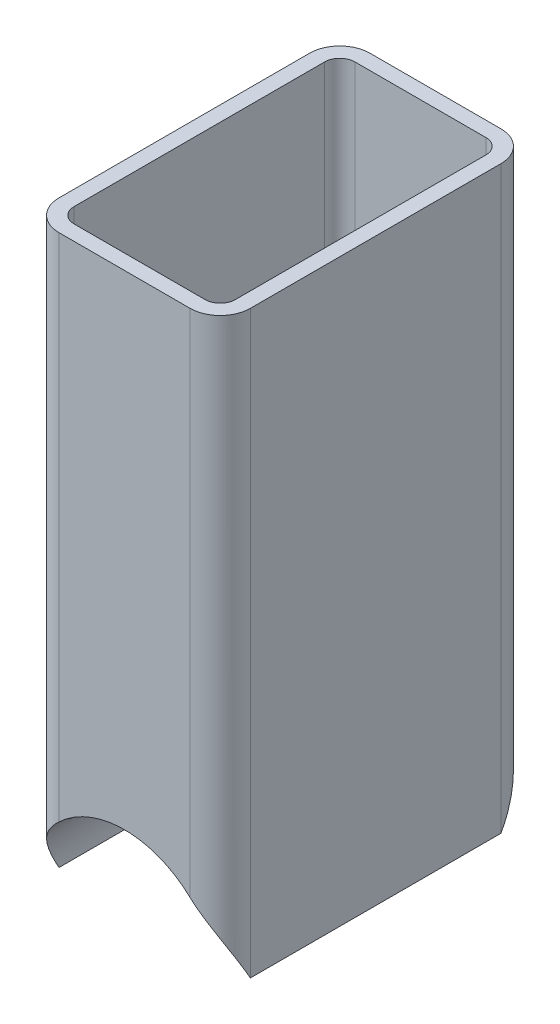
ISO-10303-21;
HEADER;
FILE_DESCRIPTION(('STEP AP214'),'2;1');
FILE_NAME('part.step','',(''),(''),'','','');
FILE_SCHEMA(('AUTOMOTIVE_DESIGN { 1 0 10303 214 1 1 1 1 }'));
ENDSEC;
DATA;
#1=APPLICATION_CONTEXT('core data for automotive mechanical design processes');
#2=APPLICATION_PROTOCOL_DEFINITION('international standard','automotive_design',2000,#1);
#3=PRODUCT_CONTEXT('',#1,'mechanical');
#4=PRODUCT('Part','Part','',(#3));
#5=PRODUCT_RELATED_PRODUCT_CATEGORY('part','',(#4));
#6=PRODUCT_DEFINITION_FORMATION('','',#4);
#7=PRODUCT_DEFINITION_CONTEXT('part definition',#1,'design');
#8=PRODUCT_DEFINITION('design','',#6,#7);
#9=PRODUCT_DEFINITION_SHAPE('','',#8);
#10=(LENGTH_UNIT() NAMED_UNIT(*) SI_UNIT(.MILLI.,.METRE.));
#11=(NAMED_UNIT(*) PLANE_ANGLE_UNIT() SI_UNIT($,.RADIAN.));
#12=(NAMED_UNIT(*) SI_UNIT($,.STERADIAN.) SOLID_ANGLE_UNIT());
#13=UNCERTAINTY_MEASURE_WITH_UNIT(LENGTH_MEASURE(1.E-05),#10,'distance_accuracy_value','');
#14=(GEOMETRIC_REPRESENTATION_CONTEXT(3) GLOBAL_UNCERTAINTY_ASSIGNED_CONTEXT((#13)) GLOBAL_UNIT_ASSIGNED_CONTEXT((#10,
#11,#12)) REPRESENTATION_CONTEXT('',''));
#15=CARTESIAN_POINT('',(0.,0.,0.));
#16=DIRECTION('',(0.,0.,1.));
#17=DIRECTION('',(1.,0.,0.));
#18=AXIS2_PLACEMENT_3D('',#15,#16,#17);
#19=CARTESIAN_POINT('',(27.4,242.5,-52.4));
#20=DIRECTION('',(0.,1.,0.));
#21=DIRECTION('',(0.,0.,1.));
#22=AXIS2_PLACEMENT_3D('',#19,#20,#21);
#23=PLANE('',#22);
#24=CARTESIAN_POINT('',(27.4,242.5,-52.4));
#25=DIRECTION('',(0.,1.,0.));
#26=DIRECTION('',(0.,0.,1.));
#27=AXIS2_PLACEMENT_3D('',#24,#25,#26);
#28=CIRCLE('',#27,12.6);
#29=CARTESIAN_POINT('',(40.,242.5,-52.4));
#30=VERTEX_POINT('',#29);
#31=CARTESIAN_POINT('',(27.4,242.5,-65.));
#32=VERTEX_POINT('',#31);
#33=EDGE_CURVE('E195',#30,#32,#28,.T.);
#34=ORIENTED_EDGE('',*,*,#33,.T.);
#35=DIRECTION('',(-1.,0.,0.));
#36=VECTOR('',#35,1.);
#37=CARTESIAN_POINT('',(27.4,242.5,-65.));
#38=LINE('',#37,#36);
#39=CARTESIAN_POINT('',(-27.4,242.5,-65.));
#40=VERTEX_POINT('',#39);
#41=EDGE_CURVE('E171',#32,#40,#38,.T.);
#42=ORIENTED_EDGE('',*,*,#41,.T.);
#43=CARTESIAN_POINT('',(-27.4,242.5,-52.4));
#44=DIRECTION('',(0.,1.,0.));
#45=DIRECTION('',(0.,0.,1.));
#46=AXIS2_PLACEMENT_3D('',#43,#44,#45);
#47=CIRCLE('',#46,12.6);
#48=CARTESIAN_POINT('',(-40.,242.5,-52.4));
#49=VERTEX_POINT('',#48);
#50=EDGE_CURVE('E209',#40,#49,#47,.T.);
#51=ORIENTED_EDGE('',*,*,#50,.T.);
#52=DIRECTION('',(0.,0.,1.));
#53=VECTOR('',#52,1.);
#54=CARTESIAN_POINT('',(-40.,242.5,52.4));
#55=LINE('',#54,#53);
#56=CARTESIAN_POINT('',(-40.,242.5,52.4));
#57=VERTEX_POINT('',#56);
#58=EDGE_CURVE('E207',#49,#57,#55,.T.);
#59=ORIENTED_EDGE('',*,*,#58,.T.);
#60=CARTESIAN_POINT('',(-27.4,242.5,52.4));
#61=DIRECTION('',(0.,1.,0.));
#62=DIRECTION('',(0.,0.,1.));
#63=AXIS2_PLACEMENT_3D('',#60,#61,#62);
#64=CIRCLE('',#63,12.6);
#65=CARTESIAN_POINT('',(-27.4,242.5,65.));
#66=VERTEX_POINT('',#65);
#67=EDGE_CURVE('E205',#57,#66,#64,.T.);
#68=ORIENTED_EDGE('',*,*,#67,.T.);
#69=DIRECTION('',(1.,0.,0.));
#70=VECTOR('',#69,1.);
#71=CARTESIAN_POINT('',(-27.4,242.5,65.));
#72=LINE('',#71,#70);
#73=CARTESIAN_POINT('',(27.4,242.5,65.));
#74=VERTEX_POINT('',#73);
#75=EDGE_CURVE('E203',#66,#74,#72,.T.);
#76=ORIENTED_EDGE('',*,*,#75,.T.);
#77=CARTESIAN_POINT('',(27.4,242.5,52.4));
#78=DIRECTION('',(0.,1.,0.));
#79=DIRECTION('',(0.,0.,1.));
#80=AXIS2_PLACEMENT_3D('',#77,#78,#79);
#81=CIRCLE('',#80,12.6);
#82=CARTESIAN_POINT('',(40.,242.5,52.4));
#83=VERTEX_POINT('',#82);
#84=EDGE_CURVE('E201',#74,#83,#81,.T.);
#85=ORIENTED_EDGE('',*,*,#84,.T.);
#86=DIRECTION('',(0.,0.,-1.));
#87=VECTOR('',#86,1.);
#88=CARTESIAN_POINT('',(40.,242.5,-52.4));
#89=LINE('',#88,#87);
#90=EDGE_CURVE('E192',#83,#30,#89,.T.);
#91=ORIENTED_EDGE('',*,*,#90,.T.);
#92=EDGE_LOOP('',(#34,#42,#51,#59,#68,#76,#85,#91));
#93=FACE_BOUND('',#92,.T.);
#94=DIRECTION('',(0.,0.,1.));
#95=VECTOR('',#94,1.);
#96=CARTESIAN_POINT('',(-33.7,242.5,52.4));
#97=LINE('',#96,#95);
#98=CARTESIAN_POINT('',(-33.7,242.5,-52.4));
#99=VERTEX_POINT('',#98);
#100=CARTESIAN_POINT('',(-33.7,242.5,52.4));
#101=VERTEX_POINT('',#100);
#102=EDGE_CURVE('E246',#99,#101,#97,.T.);
#103=ORIENTED_EDGE('',*,*,#102,.F.);
#104=CARTESIAN_POINT('',(-27.4,242.5,-52.4));
#105=DIRECTION('',(0.,1.,0.));
#106=DIRECTION('',(0.,0.,1.));
#107=AXIS2_PLACEMENT_3D('',#104,#105,#106);
#108=CIRCLE('',#107,6.3);
#109=CARTESIAN_POINT('',(-27.4,242.5,-58.7));
#110=VERTEX_POINT('',#109);
#111=EDGE_CURVE('E248',#110,#99,#108,.T.);
#112=ORIENTED_EDGE('',*,*,#111,.F.);
#113=DIRECTION('',(-1.,0.,0.));
#114=VECTOR('',#113,1.);
#115=CARTESIAN_POINT('',(27.4,242.5,-58.7));
#116=LINE('',#115,#114);
#117=CARTESIAN_POINT('',(27.4,242.5,-58.7));
#118=VERTEX_POINT('',#117);
#119=EDGE_CURVE('E234',#118,#110,#116,.T.);
#120=ORIENTED_EDGE('',*,*,#119,.F.);
#121=CARTESIAN_POINT('',(27.4,242.5,-52.4));
#122=DIRECTION('',(0.,1.,0.));
#123=DIRECTION('',(0.,0.,1.));
#124=AXIS2_PLACEMENT_3D('',#121,#122,#123);
#125=CIRCLE('',#124,6.3);
#126=CARTESIAN_POINT('',(33.7,242.5,-52.4));
#127=VERTEX_POINT('',#126);
#128=EDGE_CURVE('E236',#127,#118,#125,.T.);
#129=ORIENTED_EDGE('',*,*,#128,.F.);
#130=DIRECTION('',(0.,0.,-1.));
#131=VECTOR('',#130,1.);
#132=CARTESIAN_POINT('',(33.7,242.5,-52.4));
#133=LINE('',#132,#131);
#134=CARTESIAN_POINT('',(33.7,242.5,52.4));
#135=VERTEX_POINT('',#134);
#136=EDGE_CURVE('E238',#135,#127,#133,.T.);
#137=ORIENTED_EDGE('',*,*,#136,.F.);
#138=CARTESIAN_POINT('',(27.4,242.5,52.4));
#139=DIRECTION('',(0.,1.,0.));
#140=DIRECTION('',(0.,0.,1.));
#141=AXIS2_PLACEMENT_3D('',#138,#139,#140);
#142=CIRCLE('',#141,6.3);
#143=CARTESIAN_POINT('',(27.4,242.5,58.7));
#144=VERTEX_POINT('',#143);
#145=EDGE_CURVE('E240',#144,#135,#142,.T.);
#146=ORIENTED_EDGE('',*,*,#145,.F.);
#147=DIRECTION('',(1.,0.,0.));
#148=VECTOR('',#147,1.);
#149=CARTESIAN_POINT('',(-27.4,242.5,58.7));
#150=LINE('',#149,#148);
#151=CARTESIAN_POINT('',(-27.4,242.5,58.7));
#152=VERTEX_POINT('',#151);
#153=EDGE_CURVE('E242',#152,#144,#150,.T.);
#154=ORIENTED_EDGE('',*,*,#153,.F.);
#155=CARTESIAN_POINT('',(-27.4,242.5,52.4));
#156=DIRECTION('',(0.,1.,0.));
#157=DIRECTION('',(0.,0.,1.));
#158=AXIS2_PLACEMENT_3D('',#155,#156,#157);
#159=CIRCLE('',#158,6.3);
#160=EDGE_CURVE('E244',#101,#152,#159,.T.);
#161=ORIENTED_EDGE('',*,*,#160,.F.);
#162=EDGE_LOOP('',(#103,#112,#120,#129,#137,#146,#154,#161));
#163=FACE_BOUND('',#162,.T.);
#164=ADVANCED_FACE('F36',(#93,#163),#23,.T.);
#165=CARTESIAN_POINT('',(27.4,242.5,-52.4));
#166=DIRECTION('',(0.,-1.,0.));
#167=DIRECTION('',(0.,0.,-1.));
#168=AXIS2_PLACEMENT_3D('',#165,#166,#167);
#169=CYLINDRICAL_SURFACE('',#168,12.6);
#170=DIRECTION('',(0.,-1.,0.));
#171=VECTOR('',#170,1.);
#172=CARTESIAN_POINT('',(40.,242.5,-52.4));
#173=LINE('',#172,#171);
#174=CARTESIAN_POINT('',(40.,0.,-52.4));
#175=VERTEX_POINT('',#174);
#176=EDGE_CURVE('E166',#30,#175,#173,.T.);
#177=ORIENTED_EDGE('',*,*,#176,.T.);
#178=CARTESIAN_POINT('',(27.4,29.1417226669941,-65.));
#179=CARTESIAN_POINT('',(27.6463876021013,28.910073669906,-64.9999921698299));
#180=CARTESIAN_POINT('',(27.8897912936802,28.6753184902366,-64.9927736629382));
#181=CARTESIAN_POINT('',(28.3701232234698,28.2001772759021,-64.9649020958911));
#182=CARTESIAN_POINT('',(28.6070532800616,27.9597928584105,-64.9442528495774));
#183=CARTESIAN_POINT('',(29.0736357135996,27.4742951870094,-64.8905555408576));
#184=CARTESIAN_POINT('',(29.3033008247463,27.2291915756693,-64.8575306456285));
#185=CARTESIAN_POINT('',(29.7555139292573,26.7342812541868,-64.779991309922));
#186=CARTESIAN_POINT('',(29.9780613701665,26.4844741813533,-64.7354759800075));
#187=CARTESIAN_POINT('',(30.6304691551652,25.7334621388923,-64.5869521292988));
#188=CARTESIAN_POINT('',(31.0496363999953,25.2259322411954,-64.4674079906767));
#189=CARTESIAN_POINT('',(31.8582127286712,24.1967601044698,-64.1926587026663));
#190=CARTESIAN_POINT('',(32.2476023095124,23.6751089143525,-64.0374304439279));
#191=CARTESIAN_POINT('',(33.173846395797,22.3697390700546,-63.6156446127737));
#192=CARTESIAN_POINT('',(33.692971429594,21.5791512139416,-63.3312158925923));
#193=CARTESIAN_POINT('',(34.6659418894034,19.9787477982034,-62.7101557597819));
#194=CARTESIAN_POINT('',(35.1197692446621,19.1689269879328,-62.373509949734));
#195=CARTESIAN_POINT('',(35.9662146650916,17.5296141416223,-61.6568498599212));
#196=CARTESIAN_POINT('',(36.3584466750514,16.700032865379,-61.2765860369374));
#197=CARTESIAN_POINT('',(37.0801935097194,15.0295452568373,-60.48339898869));
#198=CARTESIAN_POINT('',(37.4097101831805,14.1886392591572,-60.0704767266557));
#199=CARTESIAN_POINT('',(38.0955016913396,12.2505730205973,-59.094670332201));
#200=CARTESIAN_POINT('',(38.4313726918178,11.1504576914542,-58.5232716250056));
#201=CARTESIAN_POINT('',(39.0048676207522,8.94005466072407,-57.3510511354654));
#202=CARTESIAN_POINT('',(39.2424531043847,7.82976315192348,-56.7502179422694));
#203=CARTESIAN_POINT('',(39.6211412670864,5.60651214538481,-55.5319895915375));
#204=CARTESIAN_POINT('',(39.7625363642862,4.49357114885294,-54.9146506129635));
#205=CARTESIAN_POINT('',(39.9514424504266,2.2652440240997,-53.6713314203701));
#206=CARTESIAN_POINT('',(39.9990127110697,1.14985988546655,-53.0453569135302));
#207=CARTESIAN_POINT('',(39.9999949279552,0.0232543946715715,-52.4130514961658));
#208=CARTESIAN_POINT('',(39.9999999975688,0.011627174142705,-52.4065257348183));
#209=CARTESIAN_POINT('',(40.,0.,-52.4));
#210=B_SPLINE_CURVE_WITH_KNOTS('',3,(#178,#179,#180,#181,#182,#183,#184,#185,#186,#187,#188,
#189,#190,#191,#192,#193,#194,#195,#196,#197,#198,#199,#200,#201,#202,#203,#204,#205,#206,#207,
#208,#209),.UNSPECIFIED.,.F.,.F.,(4,2,2,2,2,2,2,2,2,2,2,2,2,2,2,4),(0.,1.01437826353231,
2.02846860620993,3.04066998195501,4.05294973241506,6.05781699366282,8.06398630063468,
11.0223576677353,13.9815461786891,16.958599080891,19.9355642104996,23.7839796742742,
27.6338990430324,31.4720617471215,35.3077990017843,35.3477990046759),.UNSPECIFIED.);
#211=CARTESIAN_POINT('',(27.4,29.1417226669941,-65.));
#212=VERTEX_POINT('',#211);
#213=EDGE_CURVE('E151',#175,#212,#210,.F.);
#214=ORIENTED_EDGE('',*,*,#213,.T.);
#215=DIRECTION('',(0.,-1.,0.));
#216=VECTOR('',#215,1.);
#217=CARTESIAN_POINT('',(27.4,242.5,-65.));
#218=LINE('',#217,#216);
#219=EDGE_CURVE('E45',#32,#212,#218,.T.);
#220=ORIENTED_EDGE('',*,*,#219,.F.);
#221=ORIENTED_EDGE('',*,*,#33,.F.);
#222=EDGE_LOOP('',(#177,#214,#220,#221));
#223=FACE_BOUND('',#222,.T.);
#224=ADVANCED_FACE('F38',(#223),#169,.T.);
#225=CARTESIAN_POINT('',(27.4,242.5,-65.));
#226=DIRECTION('',(0.,0.,1.));
#227=DIRECTION('',(1.,0.,0.));
#228=AXIS2_PLACEMENT_3D('',#225,#226,#227);
#229=PLANE('',#228);
#230=ORIENTED_EDGE('',*,*,#219,.T.);
#231=CARTESIAN_POINT('',(0.,0.,-65.));
#232=DIRECTION('',(0.,0.,1.));
#233=DIRECTION('',(1.,0.,0.));
#234=AXIS2_PLACEMENT_3D('',#231,#232,#233);
#235=CIRCLE('',#234,40.);
#236=CARTESIAN_POINT('',(-27.4,29.1417226669941,-65.));
#237=VERTEX_POINT('',#236);
#238=EDGE_CURVE('E148',#212,#237,#235,.T.);
#239=ORIENTED_EDGE('',*,*,#238,.T.);
#240=DIRECTION('',(0.,-1.,0.));
#241=VECTOR('',#240,1.);
#242=CARTESIAN_POINT('',(-27.4,242.5,-65.));
#243=LINE('',#242,#241);
#244=EDGE_CURVE('E173',#40,#237,#243,.T.);
#245=ORIENTED_EDGE('',*,*,#244,.F.);
#246=ORIENTED_EDGE('',*,*,#41,.F.);
#247=EDGE_LOOP('',(#230,#239,#245,#246));
#248=FACE_BOUND('',#247,.T.);
#249=ADVANCED_FACE('F170',(#248),#229,.F.);
#250=CARTESIAN_POINT('',(-27.4,242.5,-52.4));
#251=DIRECTION('',(0.,-1.,0.));
#252=DIRECTION('',(0.,0.,-1.));
#253=AXIS2_PLACEMENT_3D('',#250,#251,#252);
#254=CYLINDRICAL_SURFACE('',#253,12.6);
#255=ORIENTED_EDGE('',*,*,#244,.T.);
#256=CARTESIAN_POINT('',(-27.4,29.1417226669941,-65.));
#257=CARTESIAN_POINT('',(-27.6463876021001,28.9100736699071,-64.9999921698299));
#258=CARTESIAN_POINT('',(-27.8897912936778,28.6753184902388,-64.9927736629382));
#259=CARTESIAN_POINT('',(-28.3701232234652,28.2001772759066,-64.9649020958914));
#260=CARTESIAN_POINT('',(-28.607053280056,27.9597928584162,-64.9442528495779));
#261=CARTESIAN_POINT('',(-29.0736357135918,27.4742951870176,-64.8905555408586));
#262=CARTESIAN_POINT('',(-29.3033008247375,27.2291915756787,-64.8575306456298));
#263=CARTESIAN_POINT('',(-29.7555139292465,26.7342812541989,-64.779991309924));
#264=CARTESIAN_POINT('',(-29.9780613701547,26.4844741813666,-64.73547598001));
#265=CARTESIAN_POINT('',(-30.6304691551548,25.7334621389047,-64.5869521293016));
#266=CARTESIAN_POINT('',(-31.0496363999871,25.2259322412055,-64.4674079906792));
#267=CARTESIAN_POINT('',(-31.8582127286673,24.196760104475,-64.1926587026679));
#268=CARTESIAN_POINT('',(-32.2476023095105,23.6751089143551,-64.0374304439287));
#269=CARTESIAN_POINT('',(-33.1738463957985,22.3697390700526,-63.615644612773));
#270=CARTESIAN_POINT('',(-33.6929714295967,21.5791512139375,-63.3312158925908));
#271=CARTESIAN_POINT('',(-34.6659418894081,19.9787477981953,-62.7101557597786));
#272=CARTESIAN_POINT('',(-35.1197692446676,19.1689269879228,-62.3735099497297));
#273=CARTESIAN_POINT('',(-35.9662146650963,17.5296141416126,-61.6568498599168));
#274=CARTESIAN_POINT('',(-36.3584466750547,16.7000328653715,-61.2765860369342));
#275=CARTESIAN_POINT('',(-37.0801935097207,15.0295452568341,-60.483398988688));
#276=CARTESIAN_POINT('',(-37.4097101831811,14.1886392591563,-60.0704767266536));
#277=CARTESIAN_POINT('',(-38.0955016913395,12.2505730205968,-59.0946703322028));
#278=CARTESIAN_POINT('',(-38.4313726918176,11.1504576914512,-58.5232716250127));
#279=CARTESIAN_POINT('',(-39.0048676207516,8.94005466073063,-57.3510511354601));
#280=CARTESIAN_POINT('',(-39.2424531043838,7.82976315194215,-56.7502179422466));
#281=CARTESIAN_POINT('',(-39.6211412670856,5.60651214537612,-55.5319895915655));
#282=CARTESIAN_POINT('',(-39.7625363642857,4.49357114880493,-54.9146506130599));
#283=CARTESIAN_POINT('',(-39.9514424504265,2.26524402415493,-53.6713314202776));
#284=CARTESIAN_POINT('',(-39.9990127110697,1.14985988566422,-53.0453569131808));
#285=CARTESIAN_POINT('',(-39.9999949279552,0.0232543946755604,-52.4130514961585));
#286=CARTESIAN_POINT('',(-39.9999999975688,0.0116271741447179,-52.4065257348146));
#287=CARTESIAN_POINT('',(-40.,0.,-52.4));
#288=B_SPLINE_CURVE_WITH_KNOTS('',3,(#256,#257,#258,#259,#260,#261,#262,#263,#264,#265,#266,
#267,#268,#269,#270,#271,#272,#273,#274,#275,#276,#277,#278,#279,#280,#281,#282,#283,#284,#285,
#286,#287),.UNSPECIFIED.,.F.,.F.,(4,2,2,2,2,2,2,2,2,2,2,2,2,2,2,4),(0.,1.01437826352752,
2.02846860620035,3.0406699819404,4.05294973239543,6.0578169936528,8.06398630063466,
11.0223576677431,13.9815461787034,16.958599080897,19.9355642104996,23.7839796742729,
27.6338990430253,31.4720617471171,35.3077990017845,35.3477990046758),.UNSPECIFIED.);
#289=CARTESIAN_POINT('',(-40.,0.,-52.4));
#290=VERTEX_POINT('',#289);
#291=EDGE_CURVE('E154',#237,#290,#288,.T.);
#292=ORIENTED_EDGE('',*,*,#291,.T.);
#293=DIRECTION('',(0.,-1.,0.));
#294=VECTOR('',#293,1.);
#295=CARTESIAN_POINT('',(-40.,242.5,-52.4));
#296=LINE('',#295,#294);
#297=EDGE_CURVE('E174',#49,#290,#296,.T.);
#298=ORIENTED_EDGE('',*,*,#297,.F.);
#299=ORIENTED_EDGE('',*,*,#50,.F.);
#300=EDGE_LOOP('',(#255,#292,#298,#299));
#301=FACE_BOUND('',#300,.T.);
#302=ADVANCED_FACE('F262',(#301),#254,.T.);
#303=CARTESIAN_POINT('',(-40.,242.5,52.4));
#304=DIRECTION('',(1.,0.,0.));
#305=DIRECTION('',(0.,0.,-1.));
#306=AXIS2_PLACEMENT_3D('',#303,#304,#305);
#307=PLANE('',#306);
#308=DIRECTION('',(0.,0.,1.));
#309=VECTOR('',#308,1.);
#310=CARTESIAN_POINT('',(-40.,0.,52.4));
#311=LINE('',#310,#309);
#312=CARTESIAN_POINT('',(-40.,0.,52.4));
#313=VERTEX_POINT('',#312);
#314=EDGE_CURVE('E196',#290,#313,#311,.T.);
#315=ORIENTED_EDGE('',*,*,#314,.T.);
#316=DIRECTION('',(0.,-1.,0.));
#317=VECTOR('',#316,1.);
#318=CARTESIAN_POINT('',(-40.,242.5,52.4));
#319=LINE('',#318,#317);
#320=EDGE_CURVE('E179',#57,#313,#319,.T.);
#321=ORIENTED_EDGE('',*,*,#320,.F.);
#322=ORIENTED_EDGE('',*,*,#58,.F.);
#323=ORIENTED_EDGE('',*,*,#297,.T.);
#324=EDGE_LOOP('',(#315,#321,#322,#323));
#325=FACE_BOUND('',#324,.T.);
#326=ADVANCED_FACE('F331',(#325),#307,.F.);
#327=CARTESIAN_POINT('',(-27.4,242.5,52.4));
#328=DIRECTION('',(0.,-1.,0.));
#329=DIRECTION('',(0.,0.,-1.));
#330=AXIS2_PLACEMENT_3D('',#327,#328,#329);
#331=CYLINDRICAL_SURFACE('',#330,12.6);
#332=ORIENTED_EDGE('',*,*,#320,.T.);
#333=CARTESIAN_POINT('',(-27.4,29.1417226669942,65.));
#334=CARTESIAN_POINT('',(-27.6463876021005,28.9100736699068,64.9999921698299));
#335=CARTESIAN_POINT('',(-27.8897912936785,28.6753184902382,64.9927736629383));
#336=CARTESIAN_POINT('',(-28.3701232234665,28.2001772759054,64.9649020958914));
#337=CARTESIAN_POINT('',(-28.6070532800576,27.9597928584146,64.9442528495777));
#338=CARTESIAN_POINT('',(-29.073635713594,27.4742951870153,64.8905555408583));
#339=CARTESIAN_POINT('',(-29.30330082474,27.229191575676,64.8575306456294));
#340=CARTESIAN_POINT('',(-29.7555139292496,26.7342812541954,64.7799913099235));
#341=CARTESIAN_POINT('',(-29.9780613701581,26.4844741813628,64.7354759800093));
#342=CARTESIAN_POINT('',(-30.6304691551577,25.7334621389012,64.5869521293008));
#343=CARTESIAN_POINT('',(-31.0496363999894,25.2259322412027,64.4674079906785));
#344=CARTESIAN_POINT('',(-31.8582127286684,24.1967601044736,64.1926587026674));
#345=CARTESIAN_POINT('',(-32.2476023095111,23.6751089143544,64.0374304439285));
#346=CARTESIAN_POINT('',(-33.1738463957981,22.3697390700532,63.6156446127732));
#347=CARTESIAN_POINT('',(-33.692971429596,21.5791512139387,63.3312158925912));
#348=CARTESIAN_POINT('',(-34.6659418894068,19.9787477981976,62.7101557597795));
#349=CARTESIAN_POINT('',(-35.1197692446661,19.1689269879257,62.3735099497309));
#350=CARTESIAN_POINT('',(-35.966214665095,17.5296141416154,61.6568498599181));
#351=CARTESIAN_POINT('',(-36.3584466750537,16.7000328653736,61.2765860369352));
#352=CARTESIAN_POINT('',(-37.0801935097203,15.0295452568351,60.4833989886886));
#353=CARTESIAN_POINT('',(-37.4097101831809,14.1886392591566,60.0704767266542));
#354=CARTESIAN_POINT('',(-38.0955016913395,12.2505730205969,59.0946703322023));
#355=CARTESIAN_POINT('',(-38.4313726918177,11.1504576914521,58.5232716250107));
#356=CARTESIAN_POINT('',(-39.0048676207518,8.94005466072877,57.3510511354616));
#357=CARTESIAN_POINT('',(-39.242453104384,7.82976315193683,56.7502179422531));
#358=CARTESIAN_POINT('',(-39.6211412670858,5.60651214537857,55.5319895915575));
#359=CARTESIAN_POINT('',(-39.7625363642859,4.49357114881855,54.9146506130324));
#360=CARTESIAN_POINT('',(-39.9514424504266,2.26524402413917,53.6713314203039));
#361=CARTESIAN_POINT('',(-39.9990127110697,1.14985988560794,53.0453569132802));
#362=CARTESIAN_POINT('',(-39.9999949279552,0.0232543946743819,52.4130514961605));
#363=CARTESIAN_POINT('',(-39.9999999975688,0.0116271741441234,52.4065257348157));
#364=CARTESIAN_POINT('',(-40.,0.,52.4));
#365=B_SPLINE_CURVE_WITH_KNOTS('',3,(#333,#334,#335,#336,#337,#338,#339,#340,#341,#342,#343,
#344,#345,#346,#347,#348,#349,#350,#351,#352,#353,#354,#355,#356,#357,#358,#359,#360,#361,#362,
#363,#364),.UNSPECIFIED.,.F.,.F.,(4,2,2,2,2,2,2,2,2,2,2,2,2,2,2,4),(0.,1.01437826352887,
2.02846860620307,3.04066998194455,4.05294973240101,6.05781699365566,8.06398630063467,
11.0223576677409,13.9815461786993,16.9585990808953,19.9355642104996,23.7839796742733,
27.6338990430274,31.4720617471184,35.3077990017845,35.3477990046759),.UNSPECIFIED.);
#366=CARTESIAN_POINT('',(-27.4,29.1417226669942,65.));
#367=VERTEX_POINT('',#366);
#368=EDGE_CURVE('E167',#313,#367,#365,.F.);
#369=ORIENTED_EDGE('',*,*,#368,.T.);
#370=DIRECTION('',(0.,-1.,0.));
#371=VECTOR('',#370,1.);
#372=CARTESIAN_POINT('',(-27.4,242.5,65.));
#373=LINE('',#372,#371);
#374=EDGE_CURVE('E182',#66,#367,#373,.T.);
#375=ORIENTED_EDGE('',*,*,#374,.F.);
#376=ORIENTED_EDGE('',*,*,#67,.F.);
#377=EDGE_LOOP('',(#332,#369,#375,#376));
#378=FACE_BOUND('',#377,.T.);
#379=ADVANCED_FACE('F327',(#378),#331,.T.);
#380=CARTESIAN_POINT('',(-27.4,242.5,65.));
#381=DIRECTION('',(0.,0.,-1.));
#382=DIRECTION('',(-1.,0.,0.));
#383=AXIS2_PLACEMENT_3D('',#380,#381,#382);
#384=PLANE('',#383);
#385=ORIENTED_EDGE('',*,*,#374,.T.);
#386=CARTESIAN_POINT('',(0.,0.,65.));
#387=DIRECTION('',(0.,0.,1.));
#388=DIRECTION('',(1.,0.,0.));
#389=AXIS2_PLACEMENT_3D('',#386,#387,#388);
#390=CIRCLE('',#389,40.);
#391=CARTESIAN_POINT('',(27.4,29.1417226669941,65.));
#392=VERTEX_POINT('',#391);
#393=EDGE_CURVE('E159',#392,#367,#390,.T.);
#394=ORIENTED_EDGE('',*,*,#393,.F.);
#395=DIRECTION('',(0.,-1.,0.));
#396=VECTOR('',#395,1.);
#397=CARTESIAN_POINT('',(27.4,242.5,65.));
#398=LINE('',#397,#396);
#399=EDGE_CURVE('E185',#74,#392,#398,.T.);
#400=ORIENTED_EDGE('',*,*,#399,.F.);
#401=ORIENTED_EDGE('',*,*,#75,.F.);
#402=EDGE_LOOP('',(#385,#394,#400,#401));
#403=FACE_BOUND('',#402,.T.);
#404=ADVANCED_FACE('F323',(#403),#384,.F.);
#405=CARTESIAN_POINT('',(27.4,242.5,52.4));
#406=DIRECTION('',(0.,-1.,0.));
#407=DIRECTION('',(0.,0.,-1.));
#408=AXIS2_PLACEMENT_3D('',#405,#406,#407);
#409=CYLINDRICAL_SURFACE('',#408,12.6);
#410=ORIENTED_EDGE('',*,*,#399,.T.);
#411=CARTESIAN_POINT('',(27.4,29.1417226669941,65.));
#412=CARTESIAN_POINT('',(27.6463876021025,28.9100736699049,64.9999921698299));
#413=CARTESIAN_POINT('',(27.8897912936826,28.6753184902342,64.9927736629381));
#414=CARTESIAN_POINT('',(28.3701232234745,28.2001772758973,64.9649020958908));
#415=CARTESIAN_POINT('',(28.6070532800676,27.9597928584045,64.9442528495768));
#416=CARTESIAN_POINT('',(29.0736357136078,27.4742951870008,64.8905555408565));
#417=CARTESIAN_POINT('',(29.3033008247556,27.2291915756593,64.8575306456271));
#418=CARTESIAN_POINT('',(29.7555139292688,26.7342812541741,64.7799913099199));
#419=CARTESIAN_POINT('',(29.978061370179,26.4844741813391,64.7354759800049));
#420=CARTESIAN_POINT('',(30.6304691551762,25.7334621388791,64.5869521292957));
#421=CARTESIAN_POINT('',(31.0496364000039,25.2259322411847,64.467407990674));
#422=CARTESIAN_POINT('',(31.8582127286754,24.1967601044643,64.1926587026647));
#423=CARTESIAN_POINT('',(32.2476023095144,23.6751089143497,64.037430443927));
#424=CARTESIAN_POINT('',(33.1738463957955,22.3697390700567,63.6156446127744));
#425=CARTESIAN_POINT('',(33.6929714295912,21.579151213946,63.3312158925939));
#426=CARTESIAN_POINT('',(34.6659418893984,19.9787477982119,62.7101557597854));
#427=CARTESIAN_POINT('',(35.1197692446563,19.1689269879433,62.3735099497386));
#428=CARTESIAN_POINT('',(35.9662146650868,17.5296141416325,61.6568498599257));
#429=CARTESIAN_POINT('',(36.3584466750479,16.700032865387,61.2765860369407));
#430=CARTESIAN_POINT('',(37.080193509718,15.0295452568407,60.4833989886921));
#431=CARTESIAN_POINT('',(37.4097101831799,14.1886392591583,60.0704767266579));
#432=CARTESIAN_POINT('',(38.0955016913398,12.2505730205977,59.0946703321992));
#433=CARTESIAN_POINT('',(38.4313726918181,11.1504576914574,58.5232716249981));
#434=CARTESIAN_POINT('',(39.004867620753,8.94005466071705,57.3510511354709));
#435=CARTESIAN_POINT('',(39.2424531043857,7.82976315190364,56.7502179422936));
#436=CARTESIAN_POINT('',(39.6211412670872,5.6065121453939,55.5319895915077));
#437=CARTESIAN_POINT('',(39.7625363642868,4.49357114890364,54.9146506128614));
#438=CARTESIAN_POINT('',(39.9514424504268,2.26524402404104,53.6713314204681));
#439=CARTESIAN_POINT('',(39.9990127110697,1.14985988525704,53.0453569139002));
#440=CARTESIAN_POINT('',(39.9999949279552,0.0232543946672349,52.4130514961735));
#441=CARTESIAN_POINT('',(39.9999999975689,0.0116271741405172,52.4065257348222));
#442=CARTESIAN_POINT('',(40.,0.,52.4));
#443=B_SPLINE_CURVE_WITH_KNOTS('',3,(#411,#412,#413,#414,#415,#416,#417,#418,#419,#420,#421,
#422,#423,#424,#425,#426,#427,#428,#429,#430,#431,#432,#433,#434,#435,#436,#437,#438,#439,#440,
#441,#442),.UNSPECIFIED.,.F.,.F.,(4,2,2,2,2,2,2,2,2,2,2,2,2,2,2,4),(0.,1.01437826353738,
2.02846860622007,3.04066998197048,4.05294973243586,6.05781699367345,8.0639863006347,
11.0223576677272,13.9815461786739,16.9585990808847,19.9355642104997,23.7839796742757,
27.6338990430401,31.4720617471263,35.3077990017844,35.3477990046759),.UNSPECIFIED.);
#444=CARTESIAN_POINT('',(40.,0.,52.4));
#445=VERTEX_POINT('',#444);
#446=EDGE_CURVE('E168',#392,#445,#443,.T.);
#447=ORIENTED_EDGE('',*,*,#446,.T.);
#448=DIRECTION('',(0.,-1.,0.));
#449=VECTOR('',#448,1.);
#450=CARTESIAN_POINT('',(40.,242.5,52.4));
#451=LINE('',#450,#449);
#452=EDGE_CURVE('E188',#83,#445,#451,.T.);
#453=ORIENTED_EDGE('',*,*,#452,.F.);
#454=ORIENTED_EDGE('',*,*,#84,.F.);
#455=EDGE_LOOP('',(#410,#447,#453,#454));
#456=FACE_BOUND('',#455,.T.);
#457=ADVANCED_FACE('F317',(#456),#409,.T.);
#458=CARTESIAN_POINT('',(40.,242.5,-52.4));
#459=DIRECTION('',(-1.,0.,0.));
#460=DIRECTION('',(0.,0.,1.));
#461=AXIS2_PLACEMENT_3D('',#458,#459,#460);
#462=PLANE('',#461);
#463=DIRECTION('',(0.,0.,-1.));
#464=VECTOR('',#463,1.);
#465=CARTESIAN_POINT('',(40.,0.,-52.4));
#466=LINE('',#465,#464);
#467=EDGE_CURVE('E193',#445,#175,#466,.T.);
#468=ORIENTED_EDGE('',*,*,#467,.T.);
#469=ORIENTED_EDGE('',*,*,#176,.F.);
#470=ORIENTED_EDGE('',*,*,#90,.F.);
#471=ORIENTED_EDGE('',*,*,#452,.T.);
#472=EDGE_LOOP('',(#468,#469,#470,#471));
#473=FACE_BOUND('',#472,.T.);
#474=ADVANCED_FACE('F322',(#473),#462,.F.);
#475=CARTESIAN_POINT('',(-27.4,242.5,-52.4));
#476=DIRECTION('',(0.,-1.,0.));
#477=DIRECTION('',(0.,0.,-1.));
#478=AXIS2_PLACEMENT_3D('',#475,#476,#477);
#479=CYLINDRICAL_SURFACE('',#478,6.3);
#480=CARTESIAN_POINT('',(-27.4,29.1417226669941,-58.7));
#481=CARTESIAN_POINT('',(-27.5253625184576,29.0238548935145,-58.6999951381813));
#482=CARTESIAN_POINT('',(-27.6499400917904,28.9051963791164,-58.6962585371563));
#483=CARTESIAN_POINT('',(-27.8973202031736,28.6665143278715,-58.6815632952959));
#484=CARTESIAN_POINT('',(-28.0201229709652,28.5464909713579,-58.670605597915));
#485=CARTESIAN_POINT('',(-28.3854596050835,28.1848008797337,-58.6272792822592));
#486=CARTESIAN_POINT('',(-28.6250772913467,27.9413678690901,-58.5844568333164));
#487=CARTESIAN_POINT('',(-29.0980017112705,27.4485786085163,-58.4717913348069));
#488=CARTESIAN_POINT('',(-29.331189404575,27.1991864019515,-58.4016115216677));
#489=CARTESIAN_POINT('',(-29.7869493619323,26.6992891681514,-58.2353508248937));
#490=CARTESIAN_POINT('',(-30.0095205581116,26.4487840317294,-58.1392673421451));
#491=CARTESIAN_POINT('',(-30.4452898905641,25.9460239738216,-57.9205339828731));
#492=CARTESIAN_POINT('',(-30.6583628357515,25.6937788614155,-57.7976118579121));
#493=CARTESIAN_POINT('',(-31.0715254918764,25.1925737986245,-57.5255363301748));
#494=CARTESIAN_POINT('',(-31.2716102464213,24.9436151309083,-57.3763729931789));
#495=CARTESIAN_POINT('',(-31.6561384226262,24.4537375404097,-57.0516955211566));
#496=CARTESIAN_POINT('',(-31.8406663203773,24.2127801738705,-56.8763402664856));
#497=CARTESIAN_POINT('',(-32.1931516489823,23.7420960838921,-56.4966758719187));
#498=CARTESIAN_POINT('',(-32.3611293139056,23.5123558244718,-56.2924028505175));
#499=CARTESIAN_POINT('',(-32.6470373002269,23.1131835466142,-55.8938035672542));
#500=CARTESIAN_POINT('',(-32.7683888600463,22.9406328372316,-55.7050765781796));
#501=CARTESIAN_POINT('',(-32.9956127218026,22.6125898324085,-55.3038419509296));
#502=CARTESIAN_POINT('',(-33.1014672888062,22.4571171312377,-55.0913075505404));
#503=CARTESIAN_POINT('',(-33.2457857300083,22.2424238240013,-54.7520554475062));
#504=CARTESIAN_POINT('',(-33.2917657117102,22.1735070390909,-54.6346182765837));
#505=CARTESIAN_POINT('',(-33.377772922179,22.0438268735459,-54.393153313775));
#506=CARTESIAN_POINT('',(-33.4177992843339,21.9830646800235,-54.2691245659748));
#507=CARTESIAN_POINT('',(-33.4908147711326,21.8716655680752,-54.0153361118204));
#508=CARTESIAN_POINT('',(-33.5238373867483,21.8209805383839,-53.8856074332562));
#509=CARTESIAN_POINT('',(-33.58211393601,21.7311869976222,-53.6206006230934));
#510=CARTESIAN_POINT('',(-33.6073737643735,21.6920697033808,-53.4853267911529));
#511=CARTESIAN_POINT('',(-33.6516559741843,21.6233195556118,-53.194253975449));
#512=CARTESIAN_POINT('',(-33.669616820772,21.5953103366258,-53.0378926114993));
#513=CARTESIAN_POINT('',(-33.6877578968692,21.5669905674404,-52.8005985347134));
#514=CARTESIAN_POINT('',(-33.6923386382772,21.5598322348484,-52.7207541359901));
#515=CARTESIAN_POINT('',(-33.6984628624953,21.550257919197,-52.5606163868471));
#516=CARTESIAN_POINT('',(-33.7000044486074,21.5478448976279,-52.4803227874095));
#517=CARTESIAN_POINT('',(-33.7,21.5478537214267,-52.4));
#518=B_SPLINE_CURVE_WITH_KNOTS('',3,(#480,#481,#482,#483,#484,#485,#486,#487,#488,#489,#490,
#491,#492,#493,#494,#495,#496,#497,#498,#499,#500,#501,#502,#503,#504,#505,#506,#507,#508,#509,
#510,#511,#512,#513,#514,#515,#516,#517),.UNSPECIFIED.,.F.,.F.,(4,2,2,2,2,2,2,2,2,2,2,2,2,2,2,2,
2,2,4),(0.,0.516115874308371,1.03216433012505,2.06362301136882,3.10820145469457,
4.15288474762163,5.20870305143037,6.2649219232875,7.31497607167458,8.36373008053734,
9.21144930026594,10.060131200413,10.4908804948216,10.9216924280953,11.3503953575732,
11.7787719399906,12.25677272008,12.4974841504634,12.7383457582791),.UNSPECIFIED.);
#519=CARTESIAN_POINT('',(-27.4,29.1417226669941,-58.7));
#520=VERTEX_POINT('',#519);
#521=CARTESIAN_POINT('',(-33.7,21.5478537214267,-52.4));
#522=VERTEX_POINT('',#521);
#523=EDGE_CURVE('E299',#520,#522,#518,.T.);
#524=ORIENTED_EDGE('',*,*,#523,.F.);
#525=DIRECTION('',(0.,-1.,0.));
#526=VECTOR('',#525,1.);
#527=CARTESIAN_POINT('',(-27.4,242.5,-58.7));
#528=LINE('',#527,#526);
#529=EDGE_CURVE('E231',#110,#520,#528,.T.);
#530=ORIENTED_EDGE('',*,*,#529,.F.);
#531=ORIENTED_EDGE('',*,*,#111,.T.);
#532=DIRECTION('',(0.,-1.,0.));
#533=VECTOR('',#532,1.);
#534=CARTESIAN_POINT('',(-33.7,242.5,-52.4));
#535=LINE('',#534,#533);
#536=EDGE_CURVE('E199',#99,#522,#535,.T.);
#537=ORIENTED_EDGE('',*,*,#536,.T.);
#538=EDGE_LOOP('',(#524,#530,#531,#537));
#539=FACE_BOUND('',#538,.T.);
#540=ADVANCED_FACE('F345',(#539),#479,.F.);
#541=CARTESIAN_POINT('',(-33.7,242.5,52.4));
#542=DIRECTION('',(1.,0.,0.));
#543=DIRECTION('',(0.,0.,-1.));
#544=AXIS2_PLACEMENT_3D('',#541,#542,#543);
#545=PLANE('',#544);
#546=DIRECTION('',(0.,0.,1.));
#547=VECTOR('',#546,1.);
#548=CARTESIAN_POINT('',(-33.7,21.5478537214267,-65.));
#549=LINE('',#548,#547);
#550=CARTESIAN_POINT('',(-33.7,21.5478537214267,52.4));
#551=VERTEX_POINT('',#550);
#552=EDGE_CURVE('E391',#522,#551,#549,.T.);
#553=ORIENTED_EDGE('',*,*,#552,.F.);
#554=ORIENTED_EDGE('',*,*,#536,.F.);
#555=ORIENTED_EDGE('',*,*,#102,.T.);
#556=DIRECTION('',(0.,-1.,0.));
#557=VECTOR('',#556,1.);
#558=CARTESIAN_POINT('',(-33.7,242.5,52.4));
#559=LINE('',#558,#557);
#560=EDGE_CURVE('E215',#101,#551,#559,.T.);
#561=ORIENTED_EDGE('',*,*,#560,.T.);
#562=EDGE_LOOP('',(#553,#554,#555,#561));
#563=FACE_BOUND('',#562,.T.);
#564=ADVANCED_FACE('F349',(#563),#545,.T.);
#565=CARTESIAN_POINT('',(-27.4,242.5,52.4));
#566=DIRECTION('',(0.,-1.,0.));
#567=DIRECTION('',(0.,0.,-1.));
#568=AXIS2_PLACEMENT_3D('',#565,#566,#567);
#569=CYLINDRICAL_SURFACE('',#568,6.3);
#570=CARTESIAN_POINT('',(-33.7,21.5478537214267,52.4));
#571=CARTESIAN_POINT('',(-33.7000219114408,21.5478132267831,52.5034338078191));
#572=CARTESIAN_POINT('',(-33.6974536431672,21.5518360191334,52.6068434729767));
#573=CARTESIAN_POINT('',(-33.6873056855056,21.5676979565119,52.8126989585955));
#574=CARTESIAN_POINT('',(-33.6797317173175,21.579528178118,52.915145744151));
#575=CARTESIAN_POINT('',(-33.6598519004276,21.6105225132734,53.1172679398666));
#576=CARTESIAN_POINT('',(-33.6475996813748,21.6296034954589,53.2169615072044));
#577=CARTESIAN_POINT('',(-33.6186356435628,21.6745947449746,53.4141520407321));
#578=CARTESIAN_POINT('',(-33.6019223254747,21.7005073082918,53.5116482564464));
#579=CARTESIAN_POINT('',(-33.5595118715891,21.7660526322915,53.7287576760894));
#580=CARTESIAN_POINT('',(-33.5326094498265,21.8075003272234,53.8475899534091));
#581=CARTESIAN_POINT('',(-33.4729454713762,21.898970700851,54.0804172553187));
#582=CARTESIAN_POINT('',(-33.4401795896385,21.9489997082222,54.194408631804));
#583=CARTESIAN_POINT('',(-33.3338284426862,22.1104591178857,54.5294906082732));
#584=CARTESIAN_POINT('',(-33.2523674927409,22.232983817725,54.7428215941661));
#585=CARTESIAN_POINT('',(-33.0926783932772,22.4697681354801,55.1043733483186));
#586=CARTESIAN_POINT('',(-33.0175615426457,22.5800840009247,55.2566971737822));
#587=CARTESIAN_POINT('',(-32.8588898587147,22.8103681973118,55.5493185050315));
#588=CARTESIAN_POINT('',(-32.775330175707,22.9303420678438,55.6896090121498));
#589=CARTESIAN_POINT('',(-32.6008730360092,23.1777055347686,55.9590350678235));
#590=CARTESIAN_POINT('',(-32.5099637072425,23.3051070327678,56.0881518415202));
#591=CARTESIAN_POINT('',(-32.3218053091718,23.5653711619175,56.3357323656419));
#592=CARTESIAN_POINT('',(-32.2245567168558,23.6982333819072,56.4541969159844));
#593=CARTESIAN_POINT('',(-31.9637140345619,24.0498151540458,56.749898558607));
#594=CARTESIAN_POINT('',(-31.7956023793738,24.2718094896024,56.9192891478787));
#595=CARTESIAN_POINT('',(-31.4464905376382,24.7224522524173,57.2343768263479));
#596=CARTESIAN_POINT('',(-31.2654831214027,24.9511043690437,57.3800604721363));
#597=CARTESIAN_POINT('',(-30.8917907717631,25.4123079676178,57.6488456696783));
#598=CARTESIAN_POINT('',(-30.6990998855661,25.6448613929107,57.7719355789698));
#599=CARTESIAN_POINT('',(-30.3031342987281,26.1115625998847,57.9958486607675));
#600=CARTESIAN_POINT('',(-30.0998616609478,26.3457100631371,58.0966761532841));
#601=CARTESIAN_POINT('',(-29.6984400853973,26.7971503027266,58.2695351425727));
#602=CARTESIAN_POINT('',(-29.5009634290518,27.014451553885,58.3431097645752));
#603=CARTESIAN_POINT('',(-29.098319539927,27.4476824064852,58.4704429547741));
#604=CARTESIAN_POINT('',(-28.8931534798496,27.6636122112576,58.5242045311957));
#605=CARTESIAN_POINT('',(-28.4766921984993,28.0921122422769,58.6109441769594));
#606=CARTESIAN_POINT('',(-28.2654237752824,28.3046922373259,58.6440018876773));
#607=CARTESIAN_POINT('',(-27.836916526734,28.7262415891046,58.6885122105005));
#608=CARTESIAN_POINT('',(-27.6196750336261,28.9352092622883,58.6999550042331));
#609=CARTESIAN_POINT('',(-27.4,29.1417226669941,58.7));
#610=B_SPLINE_CURVE_WITH_KNOTS('',3,(#570,#571,#572,#573,#574,#575,#576,#577,#578,#579,#580,
#581,#582,#583,#584,#585,#586,#587,#588,#589,#590,#591,#592,#593,#594,#595,#596,#597,#598,#599,
#600,#601,#602,#603,#604,#605,#606,#607,#608,#609),.UNSPECIFIED.,.F.,.F.,(4,2,2,2,2,2,2,2,2,2,2,
2,2,2,2,2,2,2,2,4),(0.,0.310152795250974,0.619951716998647,0.926300959700635,1.23275329311434,
1.61824174571254,2.00401572619898,2.77831352059652,3.38514650304,3.99233006415681,
4.60051481107218,5.20865384878235,6.1850253065375,7.16194851668798,8.13937372684026,
9.11660910111756,10.0239947840618,10.9312426413475,11.8349788086449,12.7391253909668),.UNSPECIFIED.);
#611=CARTESIAN_POINT('',(-27.4,29.1417226669941,58.7));
#612=VERTEX_POINT('',#611);
#613=EDGE_CURVE('E290',#551,#612,#610,.T.);
#614=ORIENTED_EDGE('',*,*,#613,.F.);
#615=ORIENTED_EDGE('',*,*,#560,.F.);
#616=ORIENTED_EDGE('',*,*,#160,.T.);
#617=DIRECTION('',(0.,-1.,0.));
#618=VECTOR('',#617,1.);
#619=CARTESIAN_POINT('',(-27.4,242.5,58.7));
#620=LINE('',#619,#618);
#621=EDGE_CURVE('E218',#152,#612,#620,.T.);
#622=ORIENTED_EDGE('',*,*,#621,.T.);
#623=EDGE_LOOP('',(#614,#615,#616,#622));
#624=FACE_BOUND('',#623,.T.);
#625=ADVANCED_FACE('F352',(#624),#569,.F.);
#626=CARTESIAN_POINT('',(-27.4,242.5,58.7));
#627=DIRECTION('',(0.,0.,-1.));
#628=DIRECTION('',(-1.,0.,0.));
#629=AXIS2_PLACEMENT_3D('',#626,#627,#628);
#630=PLANE('',#629);
#631=CARTESIAN_POINT('',(0.,0.,58.7));
#632=DIRECTION('',(0.,0.,-1.));
#633=DIRECTION('',(-1.,0.,0.));
#634=AXIS2_PLACEMENT_3D('',#631,#632,#633);
#635=CIRCLE('',#634,40.);
#636=CARTESIAN_POINT('',(27.4,29.1417226669941,58.7));
#637=VERTEX_POINT('',#636);
#638=EDGE_CURVE('E393',#612,#637,#635,.T.);
#639=ORIENTED_EDGE('',*,*,#638,.F.);
#640=ORIENTED_EDGE('',*,*,#621,.F.);
#641=ORIENTED_EDGE('',*,*,#153,.T.);
#642=DIRECTION('',(0.,-1.,0.));
#643=VECTOR('',#642,1.);
#644=CARTESIAN_POINT('',(27.4,242.5,58.7));
#645=LINE('',#644,#643);
#646=EDGE_CURVE('E221',#144,#637,#645,.T.);
#647=ORIENTED_EDGE('',*,*,#646,.T.);
#648=EDGE_LOOP('',(#639,#640,#641,#647));
#649=FACE_BOUND('',#648,.T.);
#650=ADVANCED_FACE('F357',(#649),#630,.T.);
#651=CARTESIAN_POINT('',(27.4,242.5,52.4));
#652=DIRECTION('',(0.,-1.,0.));
#653=DIRECTION('',(0.,0.,-1.));
#654=AXIS2_PLACEMENT_3D('',#651,#652,#653);
#655=CYLINDRICAL_SURFACE('',#654,6.3);
#656=CARTESIAN_POINT('',(27.4,29.1417226669941,58.7));
#657=CARTESIAN_POINT('',(27.5253625184576,29.0238548935145,58.6999951381813));
#658=CARTESIAN_POINT('',(27.6499400917905,28.9051963791163,58.6962585371564));
#659=CARTESIAN_POINT('',(27.8973202031736,28.6665143278715,58.6815632952959));
#660=CARTESIAN_POINT('',(28.0201229709652,28.5464909713578,58.670605597915));
#661=CARTESIAN_POINT('',(28.3854596050836,28.1848008797337,58.6272792822592));
#662=CARTESIAN_POINT('',(28.6250772913467,27.9413678690901,58.5844568333164));
#663=CARTESIAN_POINT('',(29.0980017112705,27.4485786085163,58.4717913348069));
#664=CARTESIAN_POINT('',(29.331189404575,27.1991864019515,58.4016115216677));
#665=CARTESIAN_POINT('',(29.7869493619323,26.6992891681514,58.2353508248937));
#666=CARTESIAN_POINT('',(30.0095205581116,26.4487840317294,58.1392673421451));
#667=CARTESIAN_POINT('',(30.4452898905641,25.9460239738216,57.9205339828731));
#668=CARTESIAN_POINT('',(30.6583628357516,25.6937788614155,57.7976118579121));
#669=CARTESIAN_POINT('',(31.0715254918764,25.1925737986245,57.5255363301748));
#670=CARTESIAN_POINT('',(31.2716102464213,24.9436151309083,57.3763729931789));
#671=CARTESIAN_POINT('',(31.6561384226262,24.4537375404097,57.0516955211566));
#672=CARTESIAN_POINT('',(31.8406663203773,24.2127801738705,56.8763402664856));
#673=CARTESIAN_POINT('',(32.1931516489823,23.742096083892,56.4966758719187));
#674=CARTESIAN_POINT('',(32.3611293139056,23.5123558244718,56.2924028505175));
#675=CARTESIAN_POINT('',(32.6470373002269,23.1131835466142,55.8938035672542));
#676=CARTESIAN_POINT('',(32.7683888600463,22.9406328372315,55.7050765781796));
#677=CARTESIAN_POINT('',(32.9956127218026,22.6125898324084,55.3038419509296));
#678=CARTESIAN_POINT('',(33.1014672888062,22.4571171312377,55.0913075505404));
#679=CARTESIAN_POINT('',(33.2457857300084,22.2424238240013,54.7520554475062));
#680=CARTESIAN_POINT('',(33.2917657117103,22.1735070390909,54.6346182765837));
#681=CARTESIAN_POINT('',(33.3777729221791,22.0438268735459,54.393153313775));
#682=CARTESIAN_POINT('',(33.4177992843339,21.9830646800235,54.2691245659748));
#683=CARTESIAN_POINT('',(33.4908147711326,21.8716655680752,54.0153361118204));
#684=CARTESIAN_POINT('',(33.5238373867483,21.8209805383838,53.8856074332563));
#685=CARTESIAN_POINT('',(33.58211393601,21.7311869976221,53.6206006230934));
#686=CARTESIAN_POINT('',(33.6073737643736,21.6920697033807,53.4853267911529));
#687=CARTESIAN_POINT('',(33.6516559741843,21.6233195556118,53.194253975449));
#688=CARTESIAN_POINT('',(33.669616820772,21.5953103366257,53.0378926114994));
#689=CARTESIAN_POINT('',(33.6877578968692,21.5669905674403,52.8005985347135));
#690=CARTESIAN_POINT('',(33.6923386382772,21.5598322348484,52.7207541359901));
#691=CARTESIAN_POINT('',(33.6984628624953,21.550257919197,52.5606163868471));
#692=CARTESIAN_POINT('',(33.7000044486074,21.5478448976279,52.4803227874095));
#693=CARTESIAN_POINT('',(33.7,21.5478537214266,52.4));
#694=B_SPLINE_CURVE_WITH_KNOTS('',3,(#656,#657,#658,#659,#660,#661,#662,#663,#664,#665,#666,
#667,#668,#669,#670,#671,#672,#673,#674,#675,#676,#677,#678,#679,#680,#681,#682,#683,#684,#685,
#686,#687,#688,#689,#690,#691,#692,#693),.UNSPECIFIED.,.F.,.F.,(4,2,2,2,2,2,2,2,2,2,2,2,2,2,2,2,
2,2,4),(0.,0.516115874308367,1.03216433012505,2.06362301136883,3.10820145469456,
4.15288474762163,5.20870305143037,6.26492192328751,7.31497607167459,8.36373008053736,
9.21144930026595,10.060131200413,10.4908804948216,10.9216924280953,11.3503953575732,
11.7787719399906,12.25677272008,12.4974841504633,12.7383457582791),.UNSPECIFIED.);
#695=CARTESIAN_POINT('',(33.7,21.5478537214266,52.4));
#696=VERTEX_POINT('',#695);
#697=EDGE_CURVE('E281',#637,#696,#694,.T.);
#698=ORIENTED_EDGE('',*,*,#697,.F.);
#699=ORIENTED_EDGE('',*,*,#646,.F.);
#700=ORIENTED_EDGE('',*,*,#145,.T.);
#701=DIRECTION('',(0.,-1.,0.));
#702=VECTOR('',#701,1.);
#703=CARTESIAN_POINT('',(33.7,242.5,52.4));
#704=LINE('',#703,#702);
#705=EDGE_CURVE('E224',#135,#696,#704,.T.);
#706=ORIENTED_EDGE('',*,*,#705,.T.);
#707=EDGE_LOOP('',(#698,#699,#700,#706));
#708=FACE_BOUND('',#707,.T.);
#709=ADVANCED_FACE('F360',(#708),#655,.F.);
#710=CARTESIAN_POINT('',(33.7,242.5,-52.4));
#711=DIRECTION('',(-1.,0.,0.));
#712=DIRECTION('',(0.,0.,1.));
#713=AXIS2_PLACEMENT_3D('',#710,#711,#712);
#714=PLANE('',#713);
#715=DIRECTION('',(0.,0.,1.));
#716=VECTOR('',#715,1.);
#717=CARTESIAN_POINT('',(33.7,21.5478537214266,-65.));
#718=LINE('',#717,#716);
#719=CARTESIAN_POINT('',(33.7,21.5478537214266,-52.4));
#720=VERTEX_POINT('',#719);
#721=EDGE_CURVE('E378',#696,#720,#718,.F.);
#722=ORIENTED_EDGE('',*,*,#721,.F.);
#723=ORIENTED_EDGE('',*,*,#705,.F.);
#724=ORIENTED_EDGE('',*,*,#136,.T.);
#725=DIRECTION('',(0.,-1.,0.));
#726=VECTOR('',#725,1.);
#727=CARTESIAN_POINT('',(33.7,242.5,-52.4));
#728=LINE('',#727,#726);
#729=EDGE_CURVE('E227',#127,#720,#728,.T.);
#730=ORIENTED_EDGE('',*,*,#729,.T.);
#731=EDGE_LOOP('',(#722,#723,#724,#730));
#732=FACE_BOUND('',#731,.T.);
#733=ADVANCED_FACE('F365',(#732),#714,.T.);
#734=CARTESIAN_POINT('',(27.4,242.5,-52.4));
#735=DIRECTION('',(0.,-1.,0.));
#736=DIRECTION('',(0.,0.,-1.));
#737=AXIS2_PLACEMENT_3D('',#734,#735,#736);
#738=CYLINDRICAL_SURFACE('',#737,6.3);
#739=CARTESIAN_POINT('',(33.7,21.5478537214266,-52.4));
#740=CARTESIAN_POINT('',(33.7000219114409,21.5478132267831,-52.5034338078191));
#741=CARTESIAN_POINT('',(33.6974536431672,21.5518360191334,-52.6068434729767));
#742=CARTESIAN_POINT('',(33.6873056855056,21.5676979565119,-52.8126989585955));
#743=CARTESIAN_POINT('',(33.6797317173175,21.579528178118,-52.915145744151));
#744=CARTESIAN_POINT('',(33.6598519004276,21.6105225132734,-53.1172679398666));
#745=CARTESIAN_POINT('',(33.6475996813748,21.6296034954589,-53.2169615072044));
#746=CARTESIAN_POINT('',(33.6186356435628,21.6745947449746,-53.4141520407321));
#747=CARTESIAN_POINT('',(33.6019223254748,21.7005073082918,-53.5116482564464));
#748=CARTESIAN_POINT('',(33.5595118715891,21.7660526322915,-53.7287576760894));
#749=CARTESIAN_POINT('',(33.5326094498265,21.8075003272234,-53.8475899534091));
#750=CARTESIAN_POINT('',(33.4729454713763,21.898970700851,-54.0804172553187));
#751=CARTESIAN_POINT('',(33.4401795896385,21.9489997082221,-54.194408631804));
#752=CARTESIAN_POINT('',(33.3338284426862,22.1104591178857,-54.5294906082732));
#753=CARTESIAN_POINT('',(33.2523674927409,22.232983817725,-54.7428215941661));
#754=CARTESIAN_POINT('',(33.0926783932772,22.46976813548,-55.1043733483186));
#755=CARTESIAN_POINT('',(33.0175615426457,22.5800840009247,-55.2566971737822));
#756=CARTESIAN_POINT('',(32.8588898587147,22.8103681973118,-55.5493185050315));
#757=CARTESIAN_POINT('',(32.775330175707,22.9303420678438,-55.6896090121498));
#758=CARTESIAN_POINT('',(32.6008730360092,23.1777055347685,-55.9590350678235));
#759=CARTESIAN_POINT('',(32.5099637072425,23.3051070327677,-56.0881518415202));
#760=CARTESIAN_POINT('',(32.3218053091718,23.5653711619174,-56.3357323656419));
#761=CARTESIAN_POINT('',(32.2245567168558,23.6982333819071,-56.4541969159844));
#762=CARTESIAN_POINT('',(31.9637140345619,24.0498151540458,-56.749898558607));
#763=CARTESIAN_POINT('',(31.7956023793738,24.2718094896023,-56.9192891478787));
#764=CARTESIAN_POINT('',(31.4464905376382,24.7224522524173,-57.2343768263479));
#765=CARTESIAN_POINT('',(31.2654831214027,24.9511043690437,-57.3800604721363));
#766=CARTESIAN_POINT('',(30.8917907717631,25.4123079676178,-57.6488456696783));
#767=CARTESIAN_POINT('',(30.6990998855661,25.6448613929107,-57.7719355789698));
#768=CARTESIAN_POINT('',(30.3031342987281,26.1115625998847,-57.9958486607675));
#769=CARTESIAN_POINT('',(30.0998616609479,26.345710063137,-58.0966761532841));
#770=CARTESIAN_POINT('',(29.6984400853973,26.7971503027266,-58.2695351425727));
#771=CARTESIAN_POINT('',(29.5009634290518,27.014451553885,-58.3431097645752));
#772=CARTESIAN_POINT('',(29.098319539927,27.4476824064852,-58.4704429547741));
#773=CARTESIAN_POINT('',(28.8931534798496,27.6636122112576,-58.5242045311957));
#774=CARTESIAN_POINT('',(28.4766921984993,28.0921122422769,-58.6109441769594));
#775=CARTESIAN_POINT('',(28.2654237752824,28.3046922373259,-58.6440018876773));
#776=CARTESIAN_POINT('',(27.836916526734,28.7262415891046,-58.6885122105005));
#777=CARTESIAN_POINT('',(27.6196750336261,28.9352092622883,-58.6999550042331));
#778=CARTESIAN_POINT('',(27.4,29.1417226669941,-58.7));
#779=B_SPLINE_CURVE_WITH_KNOTS('',3,(#739,#740,#741,#742,#743,#744,#745,#746,#747,#748,#749,
#750,#751,#752,#753,#754,#755,#756,#757,#758,#759,#760,#761,#762,#763,#764,#765,#766,#767,#768,
#769,#770,#771,#772,#773,#774,#775,#776,#777,#778),.UNSPECIFIED.,.F.,.F.,(4,2,2,2,2,2,2,2,2,2,2,
2,2,2,2,2,2,2,2,4),(0.,0.310152795250967,0.619951716998648,0.926300959700628,1.23275329311433,
1.61824174571254,2.00401572619897,2.77831352059652,3.38514650303999,3.99233006415679,
4.60051481107217,5.20865384878234,6.18502530653749,7.16194851668799,8.13937372684026,
9.11660910111756,10.0239947840618,10.9312426413475,11.8349788086449,12.7391253909668),.UNSPECIFIED.);
#780=CARTESIAN_POINT('',(27.4,29.1417226669941,-58.7));
#781=VERTEX_POINT('',#780);
#782=EDGE_CURVE('E51',#720,#781,#779,.T.);
#783=ORIENTED_EDGE('',*,*,#782,.F.);
#784=ORIENTED_EDGE('',*,*,#729,.F.);
#785=ORIENTED_EDGE('',*,*,#128,.T.);
#786=DIRECTION('',(0.,-1.,0.));
#787=VECTOR('',#786,1.);
#788=CARTESIAN_POINT('',(27.4,242.5,-58.7));
#789=LINE('',#788,#787);
#790=EDGE_CURVE('E58',#118,#781,#789,.T.);
#791=ORIENTED_EDGE('',*,*,#790,.T.);
#792=EDGE_LOOP('',(#783,#784,#785,#791));
#793=FACE_BOUND('',#792,.T.);
#794=ADVANCED_FACE('F368',(#793),#738,.F.);
#795=CARTESIAN_POINT('',(27.4,242.5,-58.7));
#796=DIRECTION('',(0.,0.,1.));
#797=DIRECTION('',(1.,0.,0.));
#798=AXIS2_PLACEMENT_3D('',#795,#796,#797);
#799=PLANE('',#798);
#800=CARTESIAN_POINT('',(0.,0.,-58.7));
#801=DIRECTION('',(0.,0.,1.));
#802=DIRECTION('',(1.,0.,0.));
#803=AXIS2_PLACEMENT_3D('',#800,#801,#802);
#804=CIRCLE('',#803,40.);
#805=EDGE_CURVE('E11',#781,#520,#804,.T.);
#806=ORIENTED_EDGE('',*,*,#805,.F.);
#807=ORIENTED_EDGE('',*,*,#790,.F.);
#808=ORIENTED_EDGE('',*,*,#119,.T.);
#809=ORIENTED_EDGE('',*,*,#529,.T.);
#810=EDGE_LOOP('',(#806,#807,#808,#809));
#811=FACE_BOUND('',#810,.T.);
#812=ADVANCED_FACE('F268',(#811),#799,.T.);
#813=CARTESIAN_POINT('',(0.,0.,-65.));
#814=DIRECTION('',(0.,0.,1.));
#815=DIRECTION('',(1.,0.,0.));
#816=AXIS2_PLACEMENT_3D('',#813,#814,#815);
#817=CYLINDRICAL_SURFACE('',#816,40.);
#818=ORIENTED_EDGE('',*,*,#523,.T.);
#819=ORIENTED_EDGE('',*,*,#552,.T.);
#820=ORIENTED_EDGE('',*,*,#613,.T.);
#821=ORIENTED_EDGE('',*,*,#638,.T.);
#822=ORIENTED_EDGE('',*,*,#697,.T.);
#823=ORIENTED_EDGE('',*,*,#721,.T.);
#824=ORIENTED_EDGE('',*,*,#782,.T.);
#825=ORIENTED_EDGE('',*,*,#805,.T.);
#826=EDGE_LOOP('',(#818,#819,#820,#821,#822,#823,#824,#825));
#827=FACE_BOUND('',#826,.T.);
#828=ORIENTED_EDGE('',*,*,#238,.F.);
#829=ORIENTED_EDGE('',*,*,#213,.F.);
#830=ORIENTED_EDGE('',*,*,#467,.F.);
#831=ORIENTED_EDGE('',*,*,#446,.F.);
#832=ORIENTED_EDGE('',*,*,#393,.T.);
#833=ORIENTED_EDGE('',*,*,#368,.F.);
#834=ORIENTED_EDGE('',*,*,#314,.F.);
#835=ORIENTED_EDGE('',*,*,#291,.F.);
#836=EDGE_LOOP('',(#828,#829,#830,#831,#832,#833,#834,#835));
#837=FACE_BOUND('',#836,.T.);
#838=ADVANCED_FACE('F150',(#827,#837),#817,.F.);
#839=CLOSED_SHELL('',(#164,#224,#249,#302,#326,#379,#404,#457,#474,#540,#564,#625,#650,#709,
#733,#794,#812,#838));
#840=MANIFOLD_SOLID_BREP('B2',#839);
#841=ADVANCED_BREP_SHAPE_REPRESENTATION('',(#18,#840),#14);
#842=SHAPE_DEFINITION_REPRESENTATION(#9,#841);
ENDSEC;
END-ISO-10303-21;
